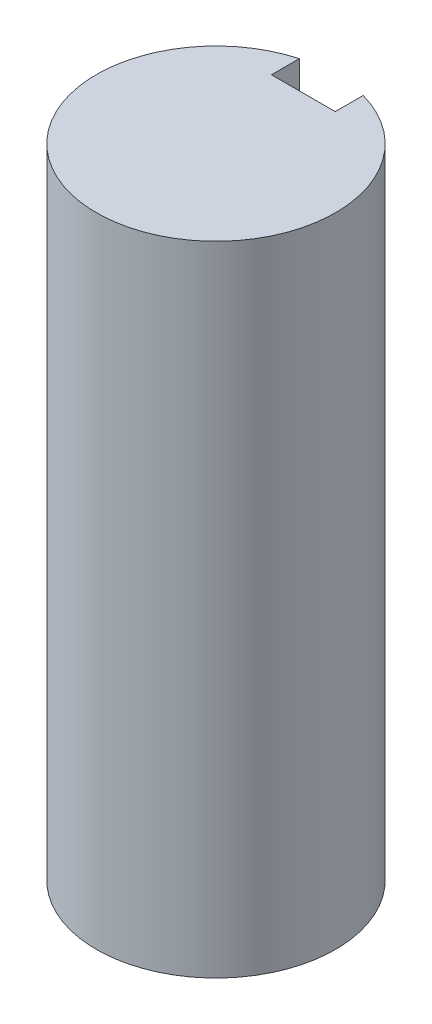
ISO-10303-21;
HEADER;
FILE_DESCRIPTION(('STEP AP214'),'2;1');
FILE_NAME('part.step','',(''),(''),'','','');
FILE_SCHEMA(('AUTOMOTIVE_DESIGN { 1 0 10303 214 1 1 1 1 }'));
ENDSEC;
DATA;
#1=APPLICATION_CONTEXT('core data for automotive mechanical design processes');
#2=APPLICATION_PROTOCOL_DEFINITION('international standard','automotive_design',2000,#1);
#3=PRODUCT_CONTEXT('',#1,'mechanical');
#4=PRODUCT('Part','Part','',(#3));
#5=PRODUCT_RELATED_PRODUCT_CATEGORY('part','',(#4));
#6=PRODUCT_DEFINITION_FORMATION('','',#4);
#7=PRODUCT_DEFINITION_CONTEXT('part definition',#1,'design');
#8=PRODUCT_DEFINITION('design','',#6,#7);
#9=PRODUCT_DEFINITION_SHAPE('','',#8);
#10=(LENGTH_UNIT() NAMED_UNIT(*) SI_UNIT(.MILLI.,.METRE.));
#11=(NAMED_UNIT(*) PLANE_ANGLE_UNIT() SI_UNIT($,.RADIAN.));
#12=(NAMED_UNIT(*) SI_UNIT($,.STERADIAN.) SOLID_ANGLE_UNIT());
#13=UNCERTAINTY_MEASURE_WITH_UNIT(LENGTH_MEASURE(1.E-05),#10,'distance_accuracy_value','');
#14=(GEOMETRIC_REPRESENTATION_CONTEXT(3) GLOBAL_UNCERTAINTY_ASSIGNED_CONTEXT((#13)) GLOBAL_UNIT_ASSIGNED_CONTEXT((#10,
#11,#12)) REPRESENTATION_CONTEXT('',''));
#15=CARTESIAN_POINT('',(0.,0.,0.));
#16=DIRECTION('',(0.,0.,1.));
#17=DIRECTION('',(1.,0.,0.));
#18=AXIS2_PLACEMENT_3D('',#15,#16,#17);
#19=CARTESIAN_POINT('',(0.,80.,0.));
#20=DIRECTION('',(0.,-1.,0.));
#21=DIRECTION('',(0.,0.,-1.));
#22=AXIS2_PLACEMENT_3D('',#19,#20,#21);
#23=CYLINDRICAL_SURFACE('',#22,15.);
#24=CARTESIAN_POINT('',(0.,80.,0.));
#25=DIRECTION('',(0.,1.,0.));
#26=DIRECTION('',(0.,0.,1.));
#27=AXIS2_PLACEMENT_3D('',#24,#25,#26);
#28=CIRCLE('',#27,15.);
#29=CARTESIAN_POINT('',(-4.,80.,-14.456832294801));
#30=VERTEX_POINT('',#29);
#31=CARTESIAN_POINT('',(4.,80.,-14.456832294801));
#32=VERTEX_POINT('',#31);
#33=EDGE_CURVE('E91',#30,#32,#28,.T.);
#34=ORIENTED_EDGE('',*,*,#33,.F.);
#35=DIRECTION('',(0.,-1.,0.));
#36=VECTOR('',#35,1.);
#37=CARTESIAN_POINT('',(-4.,80.,-14.456832294801));
#38=LINE('',#37,#36);
#39=CARTESIAN_POINT('',(-4.,0.,-14.456832294801));
#40=VERTEX_POINT('',#39);
#41=EDGE_CURVE('E77',#30,#40,#38,.T.);
#42=ORIENTED_EDGE('',*,*,#41,.T.);
#43=CARTESIAN_POINT('',(0.,0.,0.));
#44=DIRECTION('',(0.,1.,0.));
#45=DIRECTION('',(0.,0.,1.));
#46=AXIS2_PLACEMENT_3D('',#43,#44,#45);
#47=CIRCLE('',#46,15.);
#48=CARTESIAN_POINT('',(4.,0.,-14.456832294801));
#49=VERTEX_POINT('',#48);
#50=EDGE_CURVE('E42',#40,#49,#47,.T.);
#51=ORIENTED_EDGE('',*,*,#50,.T.);
#52=DIRECTION('',(0.,-1.,0.));
#53=VECTOR('',#52,1.);
#54=CARTESIAN_POINT('',(4.,80.,-14.456832294801));
#55=LINE('',#54,#53);
#56=EDGE_CURVE('E107',#32,#49,#55,.T.);
#57=ORIENTED_EDGE('',*,*,#56,.F.);
#58=EDGE_LOOP('',(#34,#42,#51,#57));
#59=FACE_BOUND('',#58,.T.);
#60=ADVANCED_FACE('F39',(#59),#23,.T.);
#61=CARTESIAN_POINT('',(0.,80.,0.));
#62=DIRECTION('',(0.,1.,0.));
#63=DIRECTION('',(0.,0.,1.));
#64=AXIS2_PLACEMENT_3D('',#61,#62,#63);
#65=PLANE('',#64);
#66=DIRECTION('',(1.,0.,0.));
#67=VECTOR('',#66,1.);
#68=CARTESIAN_POINT('',(-4.,80.,-10.956832294801));
#69=LINE('',#68,#67);
#70=CARTESIAN_POINT('',(-4.,80.,-10.956832294801));
#71=VERTEX_POINT('',#70);
#72=CARTESIAN_POINT('',(4.,80.,-10.956832294801));
#73=VERTEX_POINT('',#72);
#74=EDGE_CURVE('E49',#71,#73,#69,.T.);
#75=ORIENTED_EDGE('',*,*,#74,.F.);
#76=DIRECTION('',(0.,0.,1.));
#77=VECTOR('',#76,1.);
#78=CARTESIAN_POINT('',(-4.,80.,-14.456832294801));
#79=LINE('',#78,#77);
#80=EDGE_CURVE('E112',#30,#71,#79,.T.);
#81=ORIENTED_EDGE('',*,*,#80,.F.);
#82=ORIENTED_EDGE('',*,*,#33,.T.);
#83=DIRECTION('',(0.,0.,1.));
#84=VECTOR('',#83,1.);
#85=CARTESIAN_POINT('',(4.,80.,-14.456832294801));
#86=LINE('',#85,#84);
#87=EDGE_CURVE('E84',#32,#73,#86,.T.);
#88=ORIENTED_EDGE('',*,*,#87,.T.);
#89=EDGE_LOOP('',(#75,#81,#82,#88));
#90=FACE_BOUND('',#89,.T.);
#91=ADVANCED_FACE('F124',(#90),#65,.T.);
#92=CARTESIAN_POINT('',(0.,0.,0.));
#93=DIRECTION('',(0.,1.,0.));
#94=DIRECTION('',(0.,0.,1.));
#95=AXIS2_PLACEMENT_3D('',#92,#93,#94);
#96=PLANE('',#95);
#97=DIRECTION('',(0.,0.,1.));
#98=VECTOR('',#97,1.);
#99=CARTESIAN_POINT('',(-4.,0.,-14.456832294801));
#100=LINE('',#99,#98);
#101=CARTESIAN_POINT('',(-4.,0.,-10.956832294801));
#102=VERTEX_POINT('',#101);
#103=EDGE_CURVE('E74',#40,#102,#100,.T.);
#104=ORIENTED_EDGE('',*,*,#103,.T.);
#105=DIRECTION('',(1.,0.,0.));
#106=VECTOR('',#105,1.);
#107=CARTESIAN_POINT('',(-4.,0.,-10.956832294801));
#108=LINE('',#107,#106);
#109=CARTESIAN_POINT('',(4.,0.,-10.956832294801));
#110=VERTEX_POINT('',#109);
#111=EDGE_CURVE('E83',#102,#110,#108,.T.);
#112=ORIENTED_EDGE('',*,*,#111,.T.);
#113=DIRECTION('',(0.,0.,1.));
#114=VECTOR('',#113,1.);
#115=CARTESIAN_POINT('',(4.,0.,-14.456832294801));
#116=LINE('',#115,#114);
#117=EDGE_CURVE('E97',#49,#110,#116,.T.);
#118=ORIENTED_EDGE('',*,*,#117,.F.);
#119=ORIENTED_EDGE('',*,*,#50,.F.);
#120=EDGE_LOOP('',(#104,#112,#118,#119));
#121=FACE_BOUND('',#120,.T.);
#122=ADVANCED_FACE('F95',(#121),#96,.F.);
#123=CARTESIAN_POINT('',(4.,0.,-14.456832294801));
#124=DIRECTION('',(-1.,0.,0.));
#125=DIRECTION('',(0.,0.,1.));
#126=AXIS2_PLACEMENT_3D('',#123,#124,#125);
#127=PLANE('',#126);
#128=ORIENTED_EDGE('',*,*,#87,.F.);
#129=ORIENTED_EDGE('',*,*,#56,.T.);
#130=ORIENTED_EDGE('',*,*,#117,.T.);
#131=DIRECTION('',(0.,1.,0.));
#132=VECTOR('',#131,1.);
#133=CARTESIAN_POINT('',(4.,0.,-10.956832294801));
#134=LINE('',#133,#132);
#135=EDGE_CURVE('E109',#110,#73,#134,.T.);
#136=ORIENTED_EDGE('',*,*,#135,.T.);
#137=EDGE_LOOP('',(#128,#129,#130,#136));
#138=FACE_BOUND('',#137,.T.);
#139=ADVANCED_FACE('F121',(#138),#127,.T.);
#140=CARTESIAN_POINT('',(-4.,0.,-14.456832294801));
#141=DIRECTION('',(-1.,0.,0.));
#142=DIRECTION('',(0.,0.,1.));
#143=AXIS2_PLACEMENT_3D('',#140,#141,#142);
#144=PLANE('',#143);
#145=ORIENTED_EDGE('',*,*,#80,.T.);
#146=DIRECTION('',(0.,1.,0.));
#147=VECTOR('',#146,1.);
#148=CARTESIAN_POINT('',(-4.,0.,-10.956832294801));
#149=LINE('',#148,#147);
#150=EDGE_CURVE('E11',#102,#71,#149,.T.);
#151=ORIENTED_EDGE('',*,*,#150,.F.);
#152=ORIENTED_EDGE('',*,*,#103,.F.);
#153=ORIENTED_EDGE('',*,*,#41,.F.);
#154=EDGE_LOOP('',(#145,#151,#152,#153));
#155=FACE_BOUND('',#154,.T.);
#156=ADVANCED_FACE('F76',(#155),#144,.F.);
#157=CARTESIAN_POINT('',(-4.,0.,-10.956832294801));
#158=DIRECTION('',(0.,0.,1.));
#159=DIRECTION('',(1.,0.,0.));
#160=AXIS2_PLACEMENT_3D('',#157,#158,#159);
#161=PLANE('',#160);
#162=ORIENTED_EDGE('',*,*,#74,.T.);
#163=ORIENTED_EDGE('',*,*,#135,.F.);
#164=ORIENTED_EDGE('',*,*,#111,.F.);
#165=ORIENTED_EDGE('',*,*,#150,.T.);
#166=EDGE_LOOP('',(#162,#163,#164,#165));
#167=FACE_BOUND('',#166,.T.);
#168=ADVANCED_FACE('F125',(#167),#161,.F.);
#169=CLOSED_SHELL('',(#60,#91,#122,#139,#156,#168));
#170=MANIFOLD_SOLID_BREP('B2',#169);
#171=ADVANCED_BREP_SHAPE_REPRESENTATION('',(#18,#170),#14);
#172=SHAPE_DEFINITION_REPRESENTATION(#9,#171);
ENDSEC;
END-ISO-10303-21;
